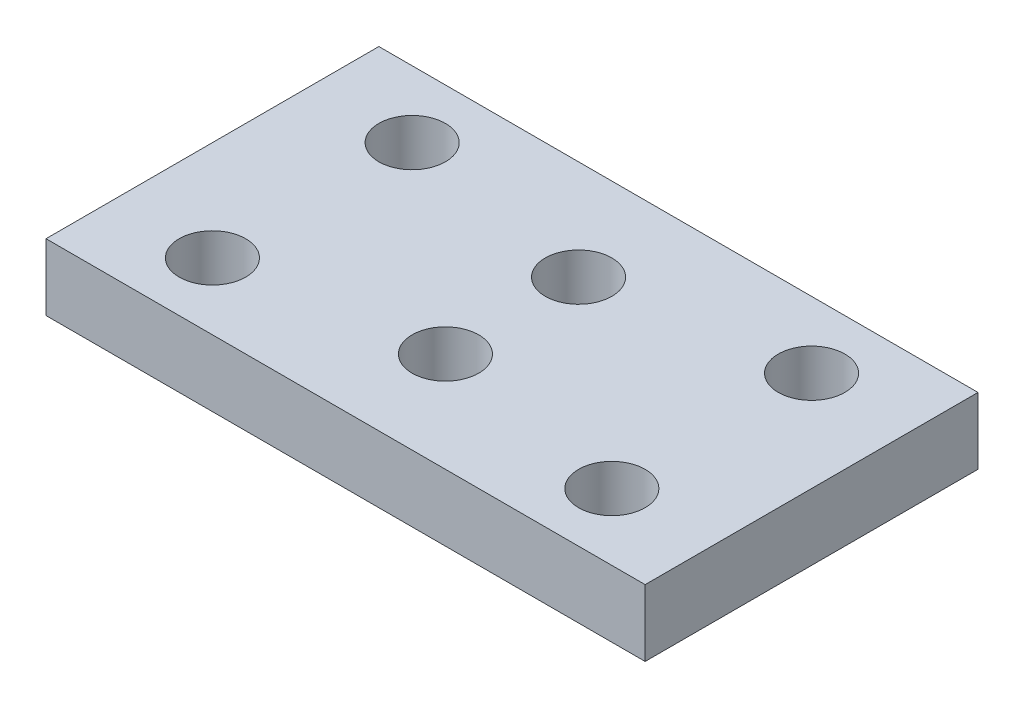
ISO-10303-21;
HEADER;
FILE_DESCRIPTION(('STEP AP214'),'2;1');
FILE_NAME('part.step','',(''),(''),'','','');
FILE_SCHEMA(('AUTOMOTIVE_DESIGN { 1 0 10303 214 1 1 1 1 }'));
ENDSEC;
DATA;
#1=APPLICATION_CONTEXT('core data for automotive mechanical design processes');
#2=APPLICATION_PROTOCOL_DEFINITION('international standard','automotive_design',2000,#1);
#3=PRODUCT_CONTEXT('',#1,'mechanical');
#4=PRODUCT('Part','Part','',(#3));
#5=PRODUCT_RELATED_PRODUCT_CATEGORY('part','',(#4));
#6=PRODUCT_DEFINITION_FORMATION('','',#4);
#7=PRODUCT_DEFINITION_CONTEXT('part definition',#1,'design');
#8=PRODUCT_DEFINITION('design','',#6,#7);
#9=PRODUCT_DEFINITION_SHAPE('','',#8);
#10=(LENGTH_UNIT() NAMED_UNIT(*) SI_UNIT(.MILLI.,.METRE.));
#11=(NAMED_UNIT(*) PLANE_ANGLE_UNIT() SI_UNIT($,.RADIAN.));
#12=(NAMED_UNIT(*) SI_UNIT($,.STERADIAN.) SOLID_ANGLE_UNIT());
#13=UNCERTAINTY_MEASURE_WITH_UNIT(LENGTH_MEASURE(1.E-05),#10,'distance_accuracy_value','');
#14=(GEOMETRIC_REPRESENTATION_CONTEXT(3) GLOBAL_UNCERTAINTY_ASSIGNED_CONTEXT((#13)) GLOBAL_UNIT_ASSIGNED_CONTEXT((#10,
#11,#12)) REPRESENTATION_CONTEXT('',''));
#15=CARTESIAN_POINT('',(0.,0.,0.));
#16=DIRECTION('',(0.,0.,1.));
#17=DIRECTION('',(1.,0.,0.));
#18=AXIS2_PLACEMENT_3D('',#15,#16,#17);
#19=CARTESIAN_POINT('',(0.,6.35,0.));
#20=DIRECTION('',(0.,-1.,0.));
#21=DIRECTION('',(0.,0.,-1.));
#22=AXIS2_PLACEMENT_3D('',#19,#20,#21);
#23=PLANE('',#22);
#24=CARTESIAN_POINT('',(28.575,6.35,-22.225));
#25=DIRECTION('',(0.,1.,0.));
#26=DIRECTION('',(0.,0.,1.));
#27=AXIS2_PLACEMENT_3D('',#24,#25,#26);
#28=CIRCLE('',#27,3.175);
#29=CARTESIAN_POINT('',(28.575,6.35,-19.05));
#30=VERTEX_POINT('',#29);
#31=EDGE_CURVE('E133',#30,#30,#28,.T.);
#32=ORIENTED_EDGE('',*,*,#31,.F.);
#33=EDGE_LOOP('',(#32));
#34=FACE_BOUND('',#33,.T.);
#35=CARTESIAN_POINT('',(47.625,6.35,-6.35000000000001));
#36=DIRECTION('',(0.,1.,0.));
#37=DIRECTION('',(0.,0.,1.));
#38=AXIS2_PLACEMENT_3D('',#35,#36,#37);
#39=CIRCLE('',#38,3.175);
#40=CARTESIAN_POINT('',(47.625,6.35,-3.17500000000001));
#41=VERTEX_POINT('',#40);
#42=EDGE_CURVE('E121',#41,#41,#39,.T.);
#43=ORIENTED_EDGE('',*,*,#42,.F.);
#44=EDGE_LOOP('',(#43));
#45=FACE_BOUND('',#44,.T.);
#46=CARTESIAN_POINT('',(9.525,6.35,-25.4));
#47=DIRECTION('',(0.,1.,0.));
#48=DIRECTION('',(0.,0.,1.));
#49=AXIS2_PLACEMENT_3D('',#46,#47,#48);
#50=CIRCLE('',#49,3.175);
#51=CARTESIAN_POINT('',(9.525,6.35,-22.225));
#52=VERTEX_POINT('',#51);
#53=EDGE_CURVE('E100',#52,#52,#50,.T.);
#54=ORIENTED_EDGE('',*,*,#53,.F.);
#55=EDGE_LOOP('',(#54));
#56=FACE_BOUND('',#55,.T.);
#57=DIRECTION('',(0.,0.,1.));
#58=VECTOR('',#57,1.);
#59=CARTESIAN_POINT('',(0.,6.35,0.));
#60=LINE('',#59,#58);
#61=CARTESIAN_POINT('',(0.,6.35,-31.75));
#62=VERTEX_POINT('',#61);
#63=CARTESIAN_POINT('',(0.,6.35,0.));
#64=VERTEX_POINT('',#63);
#65=EDGE_CURVE('E85',#62,#64,#60,.T.);
#66=ORIENTED_EDGE('',*,*,#65,.T.);
#67=DIRECTION('',(1.,0.,0.));
#68=VECTOR('',#67,1.);
#69=CARTESIAN_POINT('',(0.,6.35,0.));
#70=LINE('',#69,#68);
#71=CARTESIAN_POINT('',(57.15,6.35,0.));
#72=VERTEX_POINT('',#71);
#73=EDGE_CURVE('E80',#64,#72,#70,.T.);
#74=ORIENTED_EDGE('',*,*,#73,.T.);
#75=DIRECTION('',(0.,0.,-1.));
#76=VECTOR('',#75,1.);
#77=CARTESIAN_POINT('',(57.15,6.35,0.));
#78=LINE('',#77,#76);
#79=CARTESIAN_POINT('',(57.15,6.35,-31.75));
#80=VERTEX_POINT('',#79);
#81=EDGE_CURVE('E83',#72,#80,#78,.T.);
#82=ORIENTED_EDGE('',*,*,#81,.T.);
#83=DIRECTION('',(-1.,0.,0.));
#84=VECTOR('',#83,1.);
#85=CARTESIAN_POINT('',(0.,6.35,-31.75));
#86=LINE('',#85,#84);
#87=EDGE_CURVE('E50',#80,#62,#86,.T.);
#88=ORIENTED_EDGE('',*,*,#87,.T.);
#89=EDGE_LOOP('',(#66,#74,#82,#88));
#90=FACE_BOUND('',#89,.T.);
#91=CARTESIAN_POINT('',(47.625,6.35,-25.4));
#92=DIRECTION('',(0.,1.,0.));
#93=DIRECTION('',(0.,0.,1.));
#94=AXIS2_PLACEMENT_3D('',#91,#92,#93);
#95=CIRCLE('',#94,3.175);
#96=CARTESIAN_POINT('',(47.625,6.35,-22.225));
#97=VERTEX_POINT('',#96);
#98=EDGE_CURVE('E115',#97,#97,#95,.T.);
#99=ORIENTED_EDGE('',*,*,#98,.F.);
#100=EDGE_LOOP('',(#99));
#101=FACE_BOUND('',#100,.T.);
#102=CARTESIAN_POINT('',(9.525,6.35,-6.35));
#103=DIRECTION('',(0.,1.,0.));
#104=DIRECTION('',(0.,0.,1.));
#105=AXIS2_PLACEMENT_3D('',#102,#103,#104);
#106=CIRCLE('',#105,3.175);
#107=CARTESIAN_POINT('',(9.525,6.35,-3.175));
#108=VERTEX_POINT('',#107);
#109=EDGE_CURVE('E127',#108,#108,#106,.T.);
#110=ORIENTED_EDGE('',*,*,#109,.F.);
#111=EDGE_LOOP('',(#110));
#112=FACE_BOUND('',#111,.T.);
#113=CARTESIAN_POINT('',(28.575,6.35,-9.52500000000001));
#114=DIRECTION('',(0.,1.,0.));
#115=DIRECTION('',(0.,0.,1.));
#116=AXIS2_PLACEMENT_3D('',#113,#114,#115);
#117=CIRCLE('',#116,3.175);
#118=CARTESIAN_POINT('',(28.575,6.35,-6.35000000000001));
#119=VERTEX_POINT('',#118);
#120=EDGE_CURVE('E139',#119,#119,#117,.T.);
#121=ORIENTED_EDGE('',*,*,#120,.F.);
#122=EDGE_LOOP('',(#121));
#123=FACE_BOUND('',#122,.T.);
#124=ADVANCED_FACE('F33',(#34,#45,#56,#90,#101,#112,#123),#23,.F.);
#125=CARTESIAN_POINT('',(0.,0.,0.));
#126=DIRECTION('',(0.,-1.,0.));
#127=DIRECTION('',(0.,0.,-1.));
#128=AXIS2_PLACEMENT_3D('',#125,#126,#127);
#129=PLANE('',#128);
#130=CARTESIAN_POINT('',(28.575,0.,-22.225));
#131=DIRECTION('',(0.,1.,0.));
#132=DIRECTION('',(0.,0.,1.));
#133=AXIS2_PLACEMENT_3D('',#130,#131,#132);
#134=CIRCLE('',#133,3.175);
#135=CARTESIAN_POINT('',(28.575,0.,-19.05));
#136=VERTEX_POINT('',#135);
#137=EDGE_CURVE('E136',#136,#136,#134,.T.);
#138=ORIENTED_EDGE('',*,*,#137,.T.);
#139=EDGE_LOOP('',(#138));
#140=FACE_BOUND('',#139,.T.);
#141=CARTESIAN_POINT('',(47.625,0.,-6.35000000000001));
#142=DIRECTION('',(0.,1.,0.));
#143=DIRECTION('',(0.,0.,1.));
#144=AXIS2_PLACEMENT_3D('',#141,#142,#143);
#145=CIRCLE('',#144,3.175);
#146=CARTESIAN_POINT('',(47.625,0.,-3.17500000000001));
#147=VERTEX_POINT('',#146);
#148=EDGE_CURVE('E124',#147,#147,#145,.T.);
#149=ORIENTED_EDGE('',*,*,#148,.T.);
#150=EDGE_LOOP('',(#149));
#151=FACE_BOUND('',#150,.T.);
#152=CARTESIAN_POINT('',(9.525,0.,-25.4));
#153=DIRECTION('',(0.,1.,0.));
#154=DIRECTION('',(0.,0.,1.));
#155=AXIS2_PLACEMENT_3D('',#152,#153,#154);
#156=CIRCLE('',#155,3.175);
#157=CARTESIAN_POINT('',(9.525,0.,-22.225));
#158=VERTEX_POINT('',#157);
#159=EDGE_CURVE('E112',#158,#158,#156,.T.);
#160=ORIENTED_EDGE('',*,*,#159,.T.);
#161=EDGE_LOOP('',(#160));
#162=FACE_BOUND('',#161,.T.);
#163=DIRECTION('',(0.,0.,1.));
#164=VECTOR('',#163,1.);
#165=CARTESIAN_POINT('',(0.,0.,0.));
#166=LINE('',#165,#164);
#167=CARTESIAN_POINT('',(0.,0.,-31.75));
#168=VERTEX_POINT('',#167);
#169=CARTESIAN_POINT('',(0.,0.,0.));
#170=VERTEX_POINT('',#169);
#171=EDGE_CURVE('E97',#168,#170,#166,.T.);
#172=ORIENTED_EDGE('',*,*,#171,.F.);
#173=DIRECTION('',(-1.,0.,0.));
#174=VECTOR('',#173,1.);
#175=CARTESIAN_POINT('',(0.,0.,-31.75));
#176=LINE('',#175,#174);
#177=CARTESIAN_POINT('',(57.15,0.,-31.75));
#178=VERTEX_POINT('',#177);
#179=EDGE_CURVE('E73',#178,#168,#176,.T.);
#180=ORIENTED_EDGE('',*,*,#179,.F.);
#181=DIRECTION('',(0.,0.,-1.));
#182=VECTOR('',#181,1.);
#183=CARTESIAN_POINT('',(57.15,0.,0.));
#184=LINE('',#183,#182);
#185=CARTESIAN_POINT('',(57.15,0.,0.));
#186=VERTEX_POINT('',#185);
#187=EDGE_CURVE('E67',#186,#178,#184,.T.);
#188=ORIENTED_EDGE('',*,*,#187,.F.);
#189=DIRECTION('',(1.,0.,0.));
#190=VECTOR('',#189,1.);
#191=CARTESIAN_POINT('',(0.,0.,0.));
#192=LINE('',#191,#190);
#193=EDGE_CURVE('E89',#170,#186,#192,.T.);
#194=ORIENTED_EDGE('',*,*,#193,.F.);
#195=EDGE_LOOP('',(#172,#180,#188,#194));
#196=FACE_BOUND('',#195,.T.);
#197=CARTESIAN_POINT('',(47.625,0.,-25.4));
#198=DIRECTION('',(0.,1.,0.));
#199=DIRECTION('',(0.,0.,1.));
#200=AXIS2_PLACEMENT_3D('',#197,#198,#199);
#201=CIRCLE('',#200,3.175);
#202=CARTESIAN_POINT('',(47.625,0.,-22.225));
#203=VERTEX_POINT('',#202);
#204=EDGE_CURVE('E118',#203,#203,#201,.T.);
#205=ORIENTED_EDGE('',*,*,#204,.T.);
#206=EDGE_LOOP('',(#205));
#207=FACE_BOUND('',#206,.T.);
#208=CARTESIAN_POINT('',(9.525,0.,-6.35));
#209=DIRECTION('',(0.,1.,0.));
#210=DIRECTION('',(0.,0.,1.));
#211=AXIS2_PLACEMENT_3D('',#208,#209,#210);
#212=CIRCLE('',#211,3.175);
#213=CARTESIAN_POINT('',(9.525,0.,-3.175));
#214=VERTEX_POINT('',#213);
#215=EDGE_CURVE('E130',#214,#214,#212,.T.);
#216=ORIENTED_EDGE('',*,*,#215,.T.);
#217=EDGE_LOOP('',(#216));
#218=FACE_BOUND('',#217,.T.);
#219=CARTESIAN_POINT('',(28.575,0.,-9.52500000000001));
#220=DIRECTION('',(0.,1.,0.));
#221=DIRECTION('',(0.,0.,1.));
#222=AXIS2_PLACEMENT_3D('',#219,#220,#221);
#223=CIRCLE('',#222,3.175);
#224=CARTESIAN_POINT('',(28.575,0.,-6.35000000000001));
#225=VERTEX_POINT('',#224);
#226=EDGE_CURVE('E142',#225,#225,#223,.T.);
#227=ORIENTED_EDGE('',*,*,#226,.T.);
#228=EDGE_LOOP('',(#227));
#229=FACE_BOUND('',#228,.T.);
#230=ADVANCED_FACE('F108',(#140,#151,#162,#196,#207,#218,#229),#129,.T.);
#231=CARTESIAN_POINT('',(0.,6.35,0.));
#232=DIRECTION('',(1.,0.,0.));
#233=DIRECTION('',(0.,0.,-1.));
#234=AXIS2_PLACEMENT_3D('',#231,#232,#233);
#235=PLANE('',#234);
#236=ORIENTED_EDGE('',*,*,#171,.T.);
#237=DIRECTION('',(0.,-1.,0.));
#238=VECTOR('',#237,1.);
#239=CARTESIAN_POINT('',(0.,6.35,0.));
#240=LINE('',#239,#238);
#241=EDGE_CURVE('E11',#64,#170,#240,.T.);
#242=ORIENTED_EDGE('',*,*,#241,.F.);
#243=ORIENTED_EDGE('',*,*,#65,.F.);
#244=DIRECTION('',(0.,-1.,0.));
#245=VECTOR('',#244,1.);
#246=CARTESIAN_POINT('',(0.,6.35,-31.75));
#247=LINE('',#246,#245);
#248=EDGE_CURVE('E93',#62,#168,#247,.T.);
#249=ORIENTED_EDGE('',*,*,#248,.T.);
#250=EDGE_LOOP('',(#236,#242,#243,#249));
#251=FACE_BOUND('',#250,.T.);
#252=ADVANCED_FACE('F35',(#251),#235,.F.);
#253=CARTESIAN_POINT('',(0.,6.35,0.));
#254=DIRECTION('',(0.,0.,-1.));
#255=DIRECTION('',(-1.,0.,0.));
#256=AXIS2_PLACEMENT_3D('',#253,#254,#255);
#257=PLANE('',#256);
#258=ORIENTED_EDGE('',*,*,#193,.T.);
#259=DIRECTION('',(0.,-1.,0.));
#260=VECTOR('',#259,1.);
#261=CARTESIAN_POINT('',(57.15,6.35,0.));
#262=LINE('',#261,#260);
#263=EDGE_CURVE('E42',#72,#186,#262,.T.);
#264=ORIENTED_EDGE('',*,*,#263,.F.);
#265=ORIENTED_EDGE('',*,*,#73,.F.);
#266=ORIENTED_EDGE('',*,*,#241,.T.);
#267=EDGE_LOOP('',(#258,#264,#265,#266));
#268=FACE_BOUND('',#267,.T.);
#269=ADVANCED_FACE('F88',(#268),#257,.F.);
#270=CARTESIAN_POINT('',(57.15,6.35,0.));
#271=DIRECTION('',(-1.,0.,0.));
#272=DIRECTION('',(0.,0.,1.));
#273=AXIS2_PLACEMENT_3D('',#270,#271,#272);
#274=PLANE('',#273);
#275=ORIENTED_EDGE('',*,*,#187,.T.);
#276=DIRECTION('',(0.,-1.,0.));
#277=VECTOR('',#276,1.);
#278=CARTESIAN_POINT('',(57.15,6.35,-31.75));
#279=LINE('',#278,#277);
#280=EDGE_CURVE('E90',#80,#178,#279,.T.);
#281=ORIENTED_EDGE('',*,*,#280,.F.);
#282=ORIENTED_EDGE('',*,*,#81,.F.);
#283=ORIENTED_EDGE('',*,*,#263,.T.);
#284=EDGE_LOOP('',(#275,#281,#282,#283));
#285=FACE_BOUND('',#284,.T.);
#286=ADVANCED_FACE('F91',(#285),#274,.F.);
#287=CARTESIAN_POINT('',(0.,6.35,-31.75));
#288=DIRECTION('',(0.,0.,1.));
#289=DIRECTION('',(1.,0.,0.));
#290=AXIS2_PLACEMENT_3D('',#287,#288,#289);
#291=PLANE('',#290);
#292=ORIENTED_EDGE('',*,*,#179,.T.);
#293=ORIENTED_EDGE('',*,*,#248,.F.);
#294=ORIENTED_EDGE('',*,*,#87,.F.);
#295=ORIENTED_EDGE('',*,*,#280,.T.);
#296=EDGE_LOOP('',(#292,#293,#294,#295));
#297=FACE_BOUND('',#296,.T.);
#298=ADVANCED_FACE('F105',(#297),#291,.F.);
#299=CARTESIAN_POINT('',(9.525,6.35,-25.4));
#300=DIRECTION('',(0.,-1.,0.));
#301=DIRECTION('',(0.,0.,-1.));
#302=AXIS2_PLACEMENT_3D('',#299,#300,#301);
#303=CYLINDRICAL_SURFACE('',#302,3.175);
#304=ORIENTED_EDGE('',*,*,#53,.T.);
#305=EDGE_LOOP('',(#304));
#306=FACE_BOUND('',#305,.T.);
#307=ORIENTED_EDGE('',*,*,#159,.F.);
#308=EDGE_LOOP('',(#307));
#309=FACE_BOUND('',#308,.T.);
#310=ADVANCED_FACE('F162',(#306,#309),#303,.F.);
#311=CARTESIAN_POINT('',(47.625,6.35,-25.4));
#312=DIRECTION('',(0.,-1.,0.));
#313=DIRECTION('',(0.,0.,-1.));
#314=AXIS2_PLACEMENT_3D('',#311,#312,#313);
#315=CYLINDRICAL_SURFACE('',#314,3.175);
#316=ORIENTED_EDGE('',*,*,#98,.T.);
#317=EDGE_LOOP('',(#316));
#318=FACE_BOUND('',#317,.T.);
#319=ORIENTED_EDGE('',*,*,#204,.F.);
#320=EDGE_LOOP('',(#319));
#321=FACE_BOUND('',#320,.T.);
#322=ADVANCED_FACE('F208',(#318,#321),#315,.F.);
#323=CARTESIAN_POINT('',(47.625,6.35,-6.35000000000001));
#324=DIRECTION('',(0.,-1.,0.));
#325=DIRECTION('',(0.,0.,-1.));
#326=AXIS2_PLACEMENT_3D('',#323,#324,#325);
#327=CYLINDRICAL_SURFACE('',#326,3.175);
#328=ORIENTED_EDGE('',*,*,#42,.T.);
#329=EDGE_LOOP('',(#328));
#330=FACE_BOUND('',#329,.T.);
#331=ORIENTED_EDGE('',*,*,#148,.F.);
#332=EDGE_LOOP('',(#331));
#333=FACE_BOUND('',#332,.T.);
#334=ADVANCED_FACE('F216',(#330,#333),#327,.F.);
#335=CARTESIAN_POINT('',(9.525,6.35,-6.35));
#336=DIRECTION('',(0.,-1.,0.));
#337=DIRECTION('',(0.,0.,-1.));
#338=AXIS2_PLACEMENT_3D('',#335,#336,#337);
#339=CYLINDRICAL_SURFACE('',#338,3.175);
#340=ORIENTED_EDGE('',*,*,#109,.T.);
#341=EDGE_LOOP('',(#340));
#342=FACE_BOUND('',#341,.T.);
#343=ORIENTED_EDGE('',*,*,#215,.F.);
#344=EDGE_LOOP('',(#343));
#345=FACE_BOUND('',#344,.T.);
#346=ADVANCED_FACE('F224',(#342,#345),#339,.F.);
#347=CARTESIAN_POINT('',(28.575,6.35,-22.225));
#348=DIRECTION('',(0.,-1.,0.));
#349=DIRECTION('',(0.,0.,-1.));
#350=AXIS2_PLACEMENT_3D('',#347,#348,#349);
#351=CYLINDRICAL_SURFACE('',#350,3.175);
#352=ORIENTED_EDGE('',*,*,#31,.T.);
#353=EDGE_LOOP('',(#352));
#354=FACE_BOUND('',#353,.T.);
#355=ORIENTED_EDGE('',*,*,#137,.F.);
#356=EDGE_LOOP('',(#355));
#357=FACE_BOUND('',#356,.T.);
#358=ADVANCED_FACE('F233',(#354,#357),#351,.F.);
#359=CARTESIAN_POINT('',(28.575,6.35,-9.52500000000001));
#360=DIRECTION('',(0.,-1.,0.));
#361=DIRECTION('',(0.,0.,-1.));
#362=AXIS2_PLACEMENT_3D('',#359,#360,#361);
#363=CYLINDRICAL_SURFACE('',#362,3.175);
#364=ORIENTED_EDGE('',*,*,#120,.T.);
#365=EDGE_LOOP('',(#364));
#366=FACE_BOUND('',#365,.T.);
#367=ORIENTED_EDGE('',*,*,#226,.F.);
#368=EDGE_LOOP('',(#367));
#369=FACE_BOUND('',#368,.T.);
#370=ADVANCED_FACE('F148',(#366,#369),#363,.F.);
#371=CLOSED_SHELL('',(#124,#230,#252,#269,#286,#298,#310,#322,#334,#346,#358,#370));
#372=MANIFOLD_SOLID_BREP('B2',#371);
#373=ADVANCED_BREP_SHAPE_REPRESENTATION('',(#18,#372),#14);
#374=SHAPE_DEFINITION_REPRESENTATION(#9,#373);
ENDSEC;
END-ISO-10303-21;
